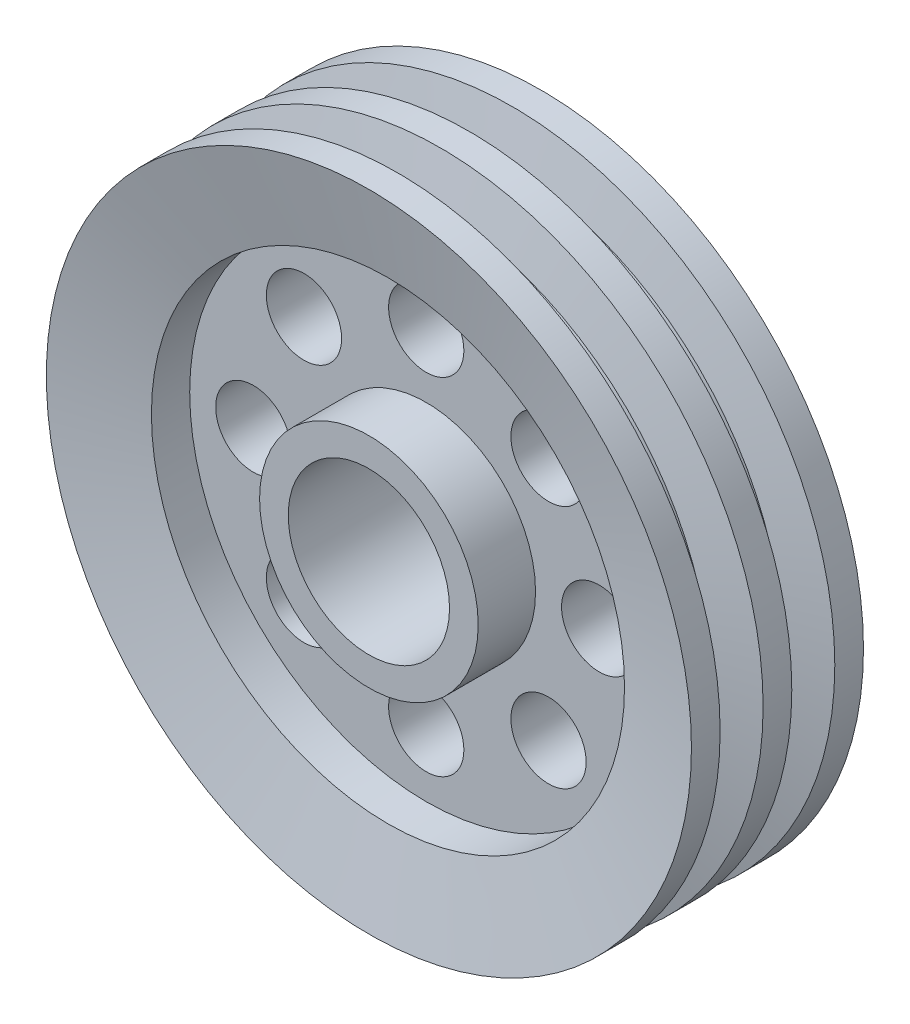
ISO-10303-21;
HEADER;
FILE_DESCRIPTION(('STEP AP214'),'2;1');
FILE_NAME('part.step','',(''),(''),'','','');
FILE_SCHEMA(('AUTOMOTIVE_DESIGN { 1 0 10303 214 1 1 1 1 }'));
ENDSEC;
DATA;
#1=APPLICATION_CONTEXT('core data for automotive mechanical design processes');
#2=APPLICATION_PROTOCOL_DEFINITION('international standard','automotive_design',2000,#1);
#3=PRODUCT_CONTEXT('',#1,'mechanical');
#4=PRODUCT('Part','Part','',(#3));
#5=PRODUCT_RELATED_PRODUCT_CATEGORY('part','',(#4));
#6=PRODUCT_DEFINITION_FORMATION('','',#4);
#7=PRODUCT_DEFINITION_CONTEXT('part definition',#1,'design');
#8=PRODUCT_DEFINITION('design','',#6,#7);
#9=PRODUCT_DEFINITION_SHAPE('','',#8);
#10=(LENGTH_UNIT() NAMED_UNIT(*) SI_UNIT(.MILLI.,.METRE.));
#11=(NAMED_UNIT(*) PLANE_ANGLE_UNIT() SI_UNIT($,.RADIAN.));
#12=(NAMED_UNIT(*) SI_UNIT($,.STERADIAN.) SOLID_ANGLE_UNIT());
#13=UNCERTAINTY_MEASURE_WITH_UNIT(LENGTH_MEASURE(1.E-05),#10,'distance_accuracy_value','');
#14=(GEOMETRIC_REPRESENTATION_CONTEXT(3) GLOBAL_UNCERTAINTY_ASSIGNED_CONTEXT((#13)) GLOBAL_UNIT_ASSIGNED_CONTEXT((#10,
#11,#12)) REPRESENTATION_CONTEXT('',''));
#15=CARTESIAN_POINT('',(0.,0.,0.));
#16=DIRECTION('',(0.,0.,1.));
#17=DIRECTION('',(1.,0.,0.));
#18=AXIS2_PLACEMENT_3D('',#15,#16,#17);
#19=CARTESIAN_POINT('',(0.,0.,40.));
#20=DIRECTION('',(0.,0.,-1.));
#21=DIRECTION('',(-1.,0.,0.));
#22=AXIS2_PLACEMENT_3D('',#19,#20,#21);
#23=CYLINDRICAL_SURFACE('',#22,150.);
#24=CARTESIAN_POINT('',(0.,0.,-40.));
#25=DIRECTION('',(0.,0.,1.));
#26=DIRECTION('',(1.,0.,0.));
#27=AXIS2_PLACEMENT_3D('',#24,#25,#26);
#28=CIRCLE('',#27,150.);
#29=CARTESIAN_POINT('',(150.,0.,-40.));
#30=VERTEX_POINT('',#29);
#31=EDGE_CURVE('E171',#30,#30,#28,.T.);
#32=ORIENTED_EDGE('',*,*,#31,.T.);
#33=EDGE_LOOP('',(#32));
#34=FACE_BOUND('',#33,.T.);
#35=CARTESIAN_POINT('',(0.,0.,-26.6666666666667));
#36=DIRECTION('',(0.,0.,1.));
#37=DIRECTION('',(1.,0.,0.));
#38=AXIS2_PLACEMENT_3D('',#35,#36,#37);
#39=CIRCLE('',#38,150.);
#40=CARTESIAN_POINT('',(150.,0.,-26.6666666666667));
#41=VERTEX_POINT('',#40);
#42=EDGE_CURVE('E404',#41,#41,#39,.T.);
#43=ORIENTED_EDGE('',*,*,#42,.F.);
#44=EDGE_LOOP('',(#43));
#45=FACE_BOUND('',#44,.T.);
#46=ADVANCED_FACE('F50',(#34,#45),#23,.T.);
#47=CARTESIAN_POINT('',(0.,0.,6.66666666666667));
#48=DIRECTION('',(0.,0.,1.));
#49=DIRECTION('',(1.,0.,0.));
#50=AXIS2_PLACEMENT_3D('',#47,#48,#49);
#51=CIRCLE('',#50,150.);
#52=CARTESIAN_POINT('',(150.,0.,6.66666666666667));
#53=VERTEX_POINT('',#52);
#54=EDGE_CURVE('E407',#53,#53,#51,.T.);
#55=ORIENTED_EDGE('',*,*,#54,.F.);
#56=EDGE_LOOP('',(#55));
#57=FACE_BOUND('',#56,.T.);
#58=CARTESIAN_POINT('',(0.,0.,-6.66666666666667));
#59=DIRECTION('',(0.,0.,1.));
#60=DIRECTION('',(1.,0.,0.));
#61=AXIS2_PLACEMENT_3D('',#58,#59,#60);
#62=CIRCLE('',#61,150.);
#63=CARTESIAN_POINT('',(150.,0.,-6.66666666666667));
#64=VERTEX_POINT('',#63);
#65=EDGE_CURVE('E400',#64,#64,#62,.T.);
#66=ORIENTED_EDGE('',*,*,#65,.T.);
#67=EDGE_LOOP('',(#66));
#68=FACE_BOUND('',#67,.T.);
#69=ADVANCED_FACE('F148',(#57,#68),#23,.T.);
#70=CARTESIAN_POINT('',(0.,0.,40.));
#71=DIRECTION('',(0.,0.,1.));
#72=DIRECTION('',(1.,0.,0.));
#73=AXIS2_PLACEMENT_3D('',#70,#71,#72);
#74=CIRCLE('',#73,150.);
#75=CARTESIAN_POINT('',(150.,0.,40.));
#76=VERTEX_POINT('',#75);
#77=EDGE_CURVE('E169',#76,#76,#74,.T.);
#78=ORIENTED_EDGE('',*,*,#77,.F.);
#79=EDGE_LOOP('',(#78));
#80=FACE_BOUND('',#79,.T.);
#81=CARTESIAN_POINT('',(0.,0.,26.6666666666667));
#82=DIRECTION('',(0.,0.,1.));
#83=DIRECTION('',(1.,0.,0.));
#84=AXIS2_PLACEMENT_3D('',#81,#82,#83);
#85=CIRCLE('',#84,150.);
#86=CARTESIAN_POINT('',(150.,0.,26.6666666666667));
#87=VERTEX_POINT('',#86);
#88=EDGE_CURVE('E173',#87,#87,#85,.T.);
#89=ORIENTED_EDGE('',*,*,#88,.T.);
#90=EDGE_LOOP('',(#89));
#91=FACE_BOUND('',#90,.T.);
#92=ADVANCED_FACE('F146',(#80,#91),#23,.T.);
#93=CARTESIAN_POINT('',(0.,0.,40.));
#94=DIRECTION('',(0.,0.,-1.));
#95=DIRECTION('',(-1.,0.,0.));
#96=AXIS2_PLACEMENT_3D('',#93,#94,#95);
#97=CYLINDRICAL_SURFACE('',#96,110.);
#98=CARTESIAN_POINT('',(0.,0.,-13.3333333333333));
#99=DIRECTION('',(0.,0.,1.));
#100=DIRECTION('',(1.,0.,0.));
#101=AXIS2_PLACEMENT_3D('',#98,#99,#100);
#102=CIRCLE('',#101,110.);
#103=CARTESIAN_POINT('',(110.,0.,-13.3333333333333));
#104=VERTEX_POINT('',#103);
#105=EDGE_CURVE('E70',#104,#104,#102,.T.);
#106=ORIENTED_EDGE('',*,*,#105,.T.);
#107=EDGE_LOOP('',(#106));
#108=FACE_BOUND('',#107,.T.);
#109=CARTESIAN_POINT('',(0.,0.,-31.1322134942825));
#110=DIRECTION('',(0.,0.,1.));
#111=DIRECTION('',(1.,0.,0.));
#112=AXIS2_PLACEMENT_3D('',#109,#110,#111);
#113=CIRCLE('',#112,110.);
#114=CARTESIAN_POINT('',(110.,0.,-31.1322134942825));
#115=VERTEX_POINT('',#114);
#116=EDGE_CURVE('E178',#115,#115,#113,.T.);
#117=ORIENTED_EDGE('',*,*,#116,.F.);
#118=EDGE_LOOP('',(#117));
#119=FACE_BOUND('',#118,.T.);
#120=ADVANCED_FACE('F142',(#108,#119),#97,.F.);
#121=CARTESIAN_POINT('',(0.,0.,31.1322134942825));
#122=DIRECTION('',(0.,0.,1.));
#123=DIRECTION('',(1.,0.,0.));
#124=AXIS2_PLACEMENT_3D('',#121,#122,#123);
#125=CIRCLE('',#124,110.);
#126=CARTESIAN_POINT('',(110.,0.,31.1322134942825));
#127=VERTEX_POINT('',#126);
#128=EDGE_CURVE('E188',#127,#127,#125,.T.);
#129=ORIENTED_EDGE('',*,*,#128,.T.);
#130=EDGE_LOOP('',(#129));
#131=FACE_BOUND('',#130,.T.);
#132=CARTESIAN_POINT('',(0.,0.,13.3333333333333));
#133=DIRECTION('',(0.,0.,1.));
#134=DIRECTION('',(1.,0.,0.));
#135=AXIS2_PLACEMENT_3D('',#132,#133,#134);
#136=CIRCLE('',#135,110.);
#137=CARTESIAN_POINT('',(110.,0.,13.3333333333333));
#138=VERTEX_POINT('',#137);
#139=EDGE_CURVE('E11',#138,#138,#136,.T.);
#140=ORIENTED_EDGE('',*,*,#139,.F.);
#141=EDGE_LOOP('',(#140));
#142=FACE_BOUND('',#141,.T.);
#143=ADVANCED_FACE('F47',(#131,#142),#97,.F.);
#144=CARTESIAN_POINT('',(56.8631703204182,56.8631703204182,13.3333333333333));
#145=DIRECTION('',(0.,0.,-1.));
#146=DIRECTION('',(-1.,0.,0.));
#147=AXIS2_PLACEMENT_3D('',#144,#145,#146);
#148=CYLINDRICAL_SURFACE('',#147,17.5);
#149=CARTESIAN_POINT('',(56.8631703204182,56.8631703204182,13.3333333333333));
#150=DIRECTION('',(0.,0.,1.));
#151=DIRECTION('',(1.,0.,0.));
#152=AXIS2_PLACEMENT_3D('',#149,#150,#151);
#153=CIRCLE('',#152,17.5);
#154=CARTESIAN_POINT('',(74.3631703204182,56.8631703204182,13.3333333333333));
#155=VERTEX_POINT('',#154);
#156=EDGE_CURVE('E59',#155,#155,#153,.T.);
#157=ORIENTED_EDGE('',*,*,#156,.T.);
#158=EDGE_LOOP('',(#157));
#159=FACE_BOUND('',#158,.T.);
#160=CARTESIAN_POINT('',(56.8631703204182,56.8631703204182,-13.3333333333333));
#161=DIRECTION('',(0.,0.,1.));
#162=DIRECTION('',(1.,0.,0.));
#163=AXIS2_PLACEMENT_3D('',#160,#161,#162);
#164=CIRCLE('',#163,17.5);
#165=CARTESIAN_POINT('',(74.3631703204182,56.8631703204182,-13.3333333333333));
#166=VERTEX_POINT('',#165);
#167=EDGE_CURVE('E93',#166,#166,#164,.T.);
#168=ORIENTED_EDGE('',*,*,#167,.F.);
#169=EDGE_LOOP('',(#168));
#170=FACE_BOUND('',#169,.T.);
#171=ADVANCED_FACE('F135',(#159,#170),#148,.F.);
#172=CARTESIAN_POINT('',(80.4166666666667,0.,13.3333333333333));
#173=DIRECTION('',(0.,0.,-1.));
#174=DIRECTION('',(-1.,0.,0.));
#175=AXIS2_PLACEMENT_3D('',#172,#173,#174);
#176=CYLINDRICAL_SURFACE('',#175,17.5);
#177=CARTESIAN_POINT('',(80.4166666666667,0.,13.3333333333333));
#178=DIRECTION('',(0.,0.,1.));
#179=DIRECTION('',(1.,0.,0.));
#180=AXIS2_PLACEMENT_3D('',#177,#178,#179);
#181=CIRCLE('',#180,17.5);
#182=CARTESIAN_POINT('',(97.9166666666667,0.,13.3333333333333));
#183=VERTEX_POINT('',#182);
#184=EDGE_CURVE('E61',#183,#183,#181,.T.);
#185=ORIENTED_EDGE('',*,*,#184,.T.);
#186=EDGE_LOOP('',(#185));
#187=FACE_BOUND('',#186,.T.);
#188=CARTESIAN_POINT('',(80.4166666666667,0.,-13.3333333333333));
#189=DIRECTION('',(0.,0.,1.));
#190=DIRECTION('',(1.,0.,0.));
#191=AXIS2_PLACEMENT_3D('',#188,#189,#190);
#192=CIRCLE('',#191,17.5);
#193=CARTESIAN_POINT('',(97.9166666666667,0.,-13.3333333333333));
#194=VERTEX_POINT('',#193);
#195=EDGE_CURVE('E90',#194,#194,#192,.T.);
#196=ORIENTED_EDGE('',*,*,#195,.F.);
#197=EDGE_LOOP('',(#196));
#198=FACE_BOUND('',#197,.T.);
#199=ADVANCED_FACE('F117',(#187,#198),#176,.F.);
#200=CARTESIAN_POINT('',(56.8631703204182,-56.8631703204182,13.3333333333333));
#201=DIRECTION('',(0.,0.,-1.));
#202=DIRECTION('',(-1.,0.,0.));
#203=AXIS2_PLACEMENT_3D('',#200,#201,#202);
#204=CYLINDRICAL_SURFACE('',#203,17.5);
#205=CARTESIAN_POINT('',(56.8631703204182,-56.8631703204182,13.3333333333333));
#206=DIRECTION('',(0.,0.,1.));
#207=DIRECTION('',(1.,0.,0.));
#208=AXIS2_PLACEMENT_3D('',#205,#206,#207);
#209=CIRCLE('',#208,17.5);
#210=CARTESIAN_POINT('',(74.3631703204182,-56.8631703204182,13.3333333333333));
#211=VERTEX_POINT('',#210);
#212=EDGE_CURVE('E113',#211,#211,#209,.T.);
#213=ORIENTED_EDGE('',*,*,#212,.T.);
#214=EDGE_LOOP('',(#213));
#215=FACE_BOUND('',#214,.T.);
#216=CARTESIAN_POINT('',(56.8631703204182,-56.8631703204182,-13.3333333333333));
#217=DIRECTION('',(0.,0.,1.));
#218=DIRECTION('',(1.,0.,0.));
#219=AXIS2_PLACEMENT_3D('',#216,#217,#218);
#220=CIRCLE('',#219,17.5);
#221=CARTESIAN_POINT('',(74.3631703204182,-56.8631703204182,-13.3333333333333));
#222=VERTEX_POINT('',#221);
#223=EDGE_CURVE('E88',#222,#222,#220,.T.);
#224=ORIENTED_EDGE('',*,*,#223,.F.);
#225=EDGE_LOOP('',(#224));
#226=FACE_BOUND('',#225,.T.);
#227=ADVANCED_FACE('F137',(#215,#226),#204,.F.);
#228=CARTESIAN_POINT('',(0.,-80.4166666666667,13.3333333333333));
#229=DIRECTION('',(0.,0.,-1.));
#230=DIRECTION('',(-1.,0.,0.));
#231=AXIS2_PLACEMENT_3D('',#228,#229,#230);
#232=CYLINDRICAL_SURFACE('',#231,17.5);
#233=CARTESIAN_POINT('',(0.,-80.4166666666667,13.3333333333333));
#234=DIRECTION('',(0.,0.,1.));
#235=DIRECTION('',(1.,0.,0.));
#236=AXIS2_PLACEMENT_3D('',#233,#234,#235);
#237=CIRCLE('',#236,17.5);
#238=CARTESIAN_POINT('',(17.5,-80.4166666666667,13.3333333333333));
#239=VERTEX_POINT('',#238);
#240=EDGE_CURVE('E115',#239,#239,#237,.T.);
#241=ORIENTED_EDGE('',*,*,#240,.T.);
#242=EDGE_LOOP('',(#241));
#243=FACE_BOUND('',#242,.T.);
#244=CARTESIAN_POINT('',(0.,-80.4166666666667,-13.3333333333333));
#245=DIRECTION('',(0.,0.,1.));
#246=DIRECTION('',(1.,0.,0.));
#247=AXIS2_PLACEMENT_3D('',#244,#245,#246);
#248=CIRCLE('',#247,17.5);
#249=CARTESIAN_POINT('',(17.5,-80.4166666666667,-13.3333333333333));
#250=VERTEX_POINT('',#249);
#251=EDGE_CURVE('E81',#250,#250,#248,.T.);
#252=ORIENTED_EDGE('',*,*,#251,.F.);
#253=EDGE_LOOP('',(#252));
#254=FACE_BOUND('',#253,.T.);
#255=ADVANCED_FACE('F253',(#243,#254),#232,.F.);
#256=CARTESIAN_POINT('',(-56.8631703204182,-56.8631703204182,13.3333333333333));
#257=DIRECTION('',(0.,0.,-1.));
#258=DIRECTION('',(-1.,0.,0.));
#259=AXIS2_PLACEMENT_3D('',#256,#257,#258);
#260=CYLINDRICAL_SURFACE('',#259,17.5);
#261=CARTESIAN_POINT('',(-56.8631703204182,-56.8631703204182,13.3333333333333));
#262=DIRECTION('',(0.,0.,1.));
#263=DIRECTION('',(1.,0.,0.));
#264=AXIS2_PLACEMENT_3D('',#261,#262,#263);
#265=CIRCLE('',#264,17.5);
#266=CARTESIAN_POINT('',(-39.3631703204182,-56.8631703204182,13.3333333333333));
#267=VERTEX_POINT('',#266);
#268=EDGE_CURVE('E108',#267,#267,#265,.T.);
#269=ORIENTED_EDGE('',*,*,#268,.T.);
#270=EDGE_LOOP('',(#269));
#271=FACE_BOUND('',#270,.T.);
#272=CARTESIAN_POINT('',(-56.8631703204182,-56.8631703204182,-13.3333333333333));
#273=DIRECTION('',(0.,0.,1.));
#274=DIRECTION('',(1.,0.,0.));
#275=AXIS2_PLACEMENT_3D('',#272,#273,#274);
#276=CIRCLE('',#275,17.5);
#277=CARTESIAN_POINT('',(-39.3631703204182,-56.8631703204182,-13.3333333333333));
#278=VERTEX_POINT('',#277);
#279=EDGE_CURVE('E77',#278,#278,#276,.T.);
#280=ORIENTED_EDGE('',*,*,#279,.F.);
#281=EDGE_LOOP('',(#280));
#282=FACE_BOUND('',#281,.T.);
#283=ADVANCED_FACE('F260',(#271,#282),#260,.F.);
#284=CARTESIAN_POINT('',(-80.4166666666667,0.,13.3333333333333));
#285=DIRECTION('',(0.,0.,-1.));
#286=DIRECTION('',(-1.,0.,0.));
#287=AXIS2_PLACEMENT_3D('',#284,#285,#286);
#288=CYLINDRICAL_SURFACE('',#287,17.5);
#289=CARTESIAN_POINT('',(-80.4166666666667,0.,13.3333333333333));
#290=DIRECTION('',(0.,0.,1.));
#291=DIRECTION('',(1.,0.,0.));
#292=AXIS2_PLACEMENT_3D('',#289,#290,#291);
#293=CIRCLE('',#292,17.5);
#294=CARTESIAN_POINT('',(-62.9166666666667,0.,13.3333333333333));
#295=VERTEX_POINT('',#294);
#296=EDGE_CURVE('E105',#295,#295,#293,.T.);
#297=ORIENTED_EDGE('',*,*,#296,.T.);
#298=EDGE_LOOP('',(#297));
#299=FACE_BOUND('',#298,.T.);
#300=CARTESIAN_POINT('',(-80.4166666666667,0.,-13.3333333333333));
#301=DIRECTION('',(0.,0.,1.));
#302=DIRECTION('',(1.,0.,0.));
#303=AXIS2_PLACEMENT_3D('',#300,#301,#302);
#304=CIRCLE('',#303,17.5);
#305=CARTESIAN_POINT('',(-62.9166666666667,0.,-13.3333333333333));
#306=VERTEX_POINT('',#305);
#307=EDGE_CURVE('E80',#306,#306,#304,.T.);
#308=ORIENTED_EDGE('',*,*,#307,.F.);
#309=EDGE_LOOP('',(#308));
#310=FACE_BOUND('',#309,.T.);
#311=ADVANCED_FACE('F263',(#299,#310),#288,.F.);
#312=CARTESIAN_POINT('',(-56.8631703204182,56.8631703204182,13.3333333333333));
#313=DIRECTION('',(0.,0.,-1.));
#314=DIRECTION('',(-1.,0.,0.));
#315=AXIS2_PLACEMENT_3D('',#312,#313,#314);
#316=CYLINDRICAL_SURFACE('',#315,17.5);
#317=CARTESIAN_POINT('',(-56.8631703204182,56.8631703204182,13.3333333333333));
#318=DIRECTION('',(0.,0.,1.));
#319=DIRECTION('',(1.,0.,0.));
#320=AXIS2_PLACEMENT_3D('',#317,#318,#319);
#321=CIRCLE('',#320,17.5);
#322=CARTESIAN_POINT('',(-39.3631703204182,56.8631703204182,13.3333333333333));
#323=VERTEX_POINT('',#322);
#324=EDGE_CURVE('E100',#323,#323,#321,.T.);
#325=ORIENTED_EDGE('',*,*,#324,.T.);
#326=EDGE_LOOP('',(#325));
#327=FACE_BOUND('',#326,.T.);
#328=CARTESIAN_POINT('',(-56.8631703204182,56.8631703204182,-13.3333333333333));
#329=DIRECTION('',(0.,0.,1.));
#330=DIRECTION('',(1.,0.,0.));
#331=AXIS2_PLACEMENT_3D('',#328,#329,#330);
#332=CIRCLE('',#331,17.5);
#333=CARTESIAN_POINT('',(-39.3631703204182,56.8631703204182,-13.3333333333333));
#334=VERTEX_POINT('',#333);
#335=EDGE_CURVE('E74',#334,#334,#332,.T.);
#336=ORIENTED_EDGE('',*,*,#335,.F.);
#337=EDGE_LOOP('',(#336));
#338=FACE_BOUND('',#337,.T.);
#339=ADVANCED_FACE('F270',(#327,#338),#316,.F.);
#340=CARTESIAN_POINT('',(0.,80.4166666666667,13.3333333333333));
#341=DIRECTION('',(0.,0.,-1.));
#342=DIRECTION('',(-1.,0.,0.));
#343=AXIS2_PLACEMENT_3D('',#340,#341,#342);
#344=CYLINDRICAL_SURFACE('',#343,17.5);
#345=CARTESIAN_POINT('',(0.,80.4166666666667,13.3333333333333));
#346=DIRECTION('',(0.,0.,1.));
#347=DIRECTION('',(1.,0.,0.));
#348=AXIS2_PLACEMENT_3D('',#345,#346,#347);
#349=CIRCLE('',#348,17.5);
#350=CARTESIAN_POINT('',(17.5,80.4166666666667,13.3333333333333));
#351=VERTEX_POINT('',#350);
#352=EDGE_CURVE('E91',#351,#351,#349,.T.);
#353=ORIENTED_EDGE('',*,*,#352,.T.);
#354=EDGE_LOOP('',(#353));
#355=FACE_BOUND('',#354,.T.);
#356=CARTESIAN_POINT('',(0.,80.4166666666667,-13.3333333333333));
#357=DIRECTION('',(0.,0.,1.));
#358=DIRECTION('',(1.,0.,0.));
#359=AXIS2_PLACEMENT_3D('',#356,#357,#358);
#360=CIRCLE('',#359,17.5);
#361=CARTESIAN_POINT('',(17.5,80.4166666666667,-13.3333333333333));
#362=VERTEX_POINT('',#361);
#363=EDGE_CURVE('E69',#362,#362,#360,.T.);
#364=ORIENTED_EDGE('',*,*,#363,.F.);
#365=EDGE_LOOP('',(#364));
#366=FACE_BOUND('',#365,.T.);
#367=ADVANCED_FACE('F130',(#355,#366),#344,.F.);
#368=CARTESIAN_POINT('',(0.,0.,13.3333333333333));
#369=DIRECTION('',(0.,0.,1.));
#370=DIRECTION('',(1.,0.,0.));
#371=AXIS2_PLACEMENT_3D('',#368,#369,#370);
#372=PLANE('',#371);
#373=ORIENTED_EDGE('',*,*,#139,.T.);
#374=EDGE_LOOP('',(#373));
#375=FACE_BOUND('',#374,.T.);
#376=ORIENTED_EDGE('',*,*,#352,.F.);
#377=EDGE_LOOP('',(#376));
#378=FACE_BOUND('',#377,.T.);
#379=ORIENTED_EDGE('',*,*,#324,.F.);
#380=EDGE_LOOP('',(#379));
#381=FACE_BOUND('',#380,.T.);
#382=ORIENTED_EDGE('',*,*,#296,.F.);
#383=EDGE_LOOP('',(#382));
#384=FACE_BOUND('',#383,.T.);
#385=ORIENTED_EDGE('',*,*,#268,.F.);
#386=EDGE_LOOP('',(#385));
#387=FACE_BOUND('',#386,.T.);
#388=ORIENTED_EDGE('',*,*,#240,.F.);
#389=EDGE_LOOP('',(#388));
#390=FACE_BOUND('',#389,.T.);
#391=ORIENTED_EDGE('',*,*,#212,.F.);
#392=EDGE_LOOP('',(#391));
#393=FACE_BOUND('',#392,.T.);
#394=ORIENTED_EDGE('',*,*,#184,.F.);
#395=EDGE_LOOP('',(#394));
#396=FACE_BOUND('',#395,.T.);
#397=ORIENTED_EDGE('',*,*,#156,.F.);
#398=EDGE_LOOP('',(#397));
#399=FACE_BOUND('',#398,.T.);
#400=CARTESIAN_POINT('',(0.,0.,13.3333333333333));
#401=DIRECTION('',(0.,0.,1.));
#402=DIRECTION('',(1.,0.,0.));
#403=AXIS2_PLACEMENT_3D('',#400,#401,#402);
#404=CIRCLE('',#403,50.8333333333333);
#405=CARTESIAN_POINT('',(50.8333333333333,0.,13.3333333333333));
#406=VERTEX_POINT('',#405);
#407=EDGE_CURVE('E53',#406,#406,#404,.T.);
#408=ORIENTED_EDGE('',*,*,#407,.F.);
#409=EDGE_LOOP('',(#408));
#410=FACE_BOUND('',#409,.T.);
#411=ADVANCED_FACE('F121',(#375,#378,#381,#384,#387,#390,#393,#396,#399,#410),#372,.T.);
#412=CARTESIAN_POINT('',(0.,0.,-13.3333333333333));
#413=DIRECTION('',(0.,0.,1.));
#414=DIRECTION('',(1.,0.,0.));
#415=AXIS2_PLACEMENT_3D('',#412,#413,#414);
#416=PLANE('',#415);
#417=ORIENTED_EDGE('',*,*,#105,.F.);
#418=EDGE_LOOP('',(#417));
#419=FACE_BOUND('',#418,.T.);
#420=ORIENTED_EDGE('',*,*,#363,.T.);
#421=EDGE_LOOP('',(#420));
#422=FACE_BOUND('',#421,.T.);
#423=ORIENTED_EDGE('',*,*,#335,.T.);
#424=EDGE_LOOP('',(#423));
#425=FACE_BOUND('',#424,.T.);
#426=ORIENTED_EDGE('',*,*,#307,.T.);
#427=EDGE_LOOP('',(#426));
#428=FACE_BOUND('',#427,.T.);
#429=ORIENTED_EDGE('',*,*,#279,.T.);
#430=EDGE_LOOP('',(#429));
#431=FACE_BOUND('',#430,.T.);
#432=ORIENTED_EDGE('',*,*,#251,.T.);
#433=EDGE_LOOP('',(#432));
#434=FACE_BOUND('',#433,.T.);
#435=ORIENTED_EDGE('',*,*,#223,.T.);
#436=EDGE_LOOP('',(#435));
#437=FACE_BOUND('',#436,.T.);
#438=ORIENTED_EDGE('',*,*,#195,.T.);
#439=EDGE_LOOP('',(#438));
#440=FACE_BOUND('',#439,.T.);
#441=ORIENTED_EDGE('',*,*,#167,.T.);
#442=EDGE_LOOP('',(#441));
#443=FACE_BOUND('',#442,.T.);
#444=CARTESIAN_POINT('',(0.,0.,-13.3333333333333));
#445=DIRECTION('',(0.,0.,1.));
#446=DIRECTION('',(1.,0.,0.));
#447=AXIS2_PLACEMENT_3D('',#444,#445,#446);
#448=CIRCLE('',#447,50.8333333333333);
#449=CARTESIAN_POINT('',(50.8333333333333,0.,-13.3333333333333));
#450=VERTEX_POINT('',#449);
#451=EDGE_CURVE('E72',#450,#450,#448,.F.);
#452=ORIENTED_EDGE('',*,*,#451,.F.);
#453=EDGE_LOOP('',(#452));
#454=FACE_BOUND('',#453,.T.);
#455=ADVANCED_FACE('F127',(#419,#422,#425,#428,#431,#434,#437,#440,#443,#454),#416,.F.);
#456=CARTESIAN_POINT('',(0.,0.,40.));
#457=DIRECTION('',(0.,0.,-1.));
#458=DIRECTION('',(-1.,0.,0.));
#459=AXIS2_PLACEMENT_3D('',#456,#457,#458);
#460=CYLINDRICAL_SURFACE('',#459,50.8333333333333);
#461=CARTESIAN_POINT('',(0.,0.,-40.));
#462=DIRECTION('',(0.,0.,1.));
#463=DIRECTION('',(1.,0.,0.));
#464=AXIS2_PLACEMENT_3D('',#461,#462,#463);
#465=CIRCLE('',#464,50.8333333333333);
#466=CARTESIAN_POINT('',(50.8333333333333,0.,-40.));
#467=VERTEX_POINT('',#466);
#468=EDGE_CURVE('E192',#467,#467,#465,.T.);
#469=ORIENTED_EDGE('',*,*,#468,.T.);
#470=EDGE_LOOP('',(#469));
#471=FACE_BOUND('',#470,.T.);
#472=ORIENTED_EDGE('',*,*,#451,.T.);
#473=EDGE_LOOP('',(#472));
#474=FACE_BOUND('',#473,.T.);
#475=ADVANCED_FACE('F203',(#471,#474),#460,.T.);
#476=CARTESIAN_POINT('',(0.,0.,40.));
#477=DIRECTION('',(0.,0.,-1.));
#478=DIRECTION('',(-1.,0.,0.));
#479=AXIS2_PLACEMENT_3D('',#476,#477,#478);
#480=CYLINDRICAL_SURFACE('',#479,37.5);
#481=CARTESIAN_POINT('',(0.,0.,40.));
#482=DIRECTION('',(0.,0.,1.));
#483=DIRECTION('',(1.,0.,0.));
#484=AXIS2_PLACEMENT_3D('',#481,#482,#483);
#485=CIRCLE('',#484,37.5);
#486=CARTESIAN_POINT('',(37.5,0.,40.));
#487=VERTEX_POINT('',#486);
#488=EDGE_CURVE('E187',#487,#487,#485,.T.);
#489=ORIENTED_EDGE('',*,*,#488,.T.);
#490=EDGE_LOOP('',(#489));
#491=FACE_BOUND('',#490,.T.);
#492=CARTESIAN_POINT('',(0.,0.,-40.));
#493=DIRECTION('',(0.,0.,1.));
#494=DIRECTION('',(1.,0.,0.));
#495=AXIS2_PLACEMENT_3D('',#492,#493,#494);
#496=CIRCLE('',#495,37.5);
#497=CARTESIAN_POINT('',(37.5,0.,-40.));
#498=VERTEX_POINT('',#497);
#499=EDGE_CURVE('E189',#498,#498,#496,.T.);
#500=ORIENTED_EDGE('',*,*,#499,.F.);
#501=EDGE_LOOP('',(#500));
#502=FACE_BOUND('',#501,.T.);
#503=ADVANCED_FACE('F224',(#491,#502),#480,.F.);
#504=ORIENTED_EDGE('',*,*,#407,.T.);
#505=EDGE_LOOP('',(#504));
#506=FACE_BOUND('',#505,.T.);
#507=CARTESIAN_POINT('',(0.,0.,40.));
#508=DIRECTION('',(0.,0.,1.));
#509=DIRECTION('',(1.,0.,0.));
#510=AXIS2_PLACEMENT_3D('',#507,#508,#509);
#511=CIRCLE('',#510,50.8333333333333);
#512=CARTESIAN_POINT('',(50.8333333333333,0.,40.));
#513=VERTEX_POINT('',#512);
#514=EDGE_CURVE('E191',#513,#513,#511,.T.);
#515=ORIENTED_EDGE('',*,*,#514,.F.);
#516=EDGE_LOOP('',(#515));
#517=FACE_BOUND('',#516,.T.);
#518=ADVANCED_FACE('F220',(#506,#517),#460,.T.);
#519=CARTESIAN_POINT('',(0.,0.,40.));
#520=DIRECTION('',(0.,0.,1.));
#521=DIRECTION('',(1.,0.,0.));
#522=AXIS2_PLACEMENT_3D('',#519,#520,#521);
#523=PLANE('',#522);
#524=ORIENTED_EDGE('',*,*,#488,.F.);
#525=EDGE_LOOP('',(#524));
#526=FACE_BOUND('',#525,.T.);
#527=ORIENTED_EDGE('',*,*,#514,.T.);
#528=EDGE_LOOP('',(#527));
#529=FACE_BOUND('',#528,.T.);
#530=ADVANCED_FACE('F210',(#526,#529),#523,.T.);
#531=CARTESIAN_POINT('',(0.,0.,-40.));
#532=DIRECTION('',(0.,0.,1.));
#533=DIRECTION('',(1.,0.,0.));
#534=AXIS2_PLACEMENT_3D('',#531,#532,#533);
#535=PLANE('',#534);
#536=ORIENTED_EDGE('',*,*,#499,.T.);
#537=EDGE_LOOP('',(#536));
#538=FACE_BOUND('',#537,.T.);
#539=ORIENTED_EDGE('',*,*,#468,.F.);
#540=EDGE_LOOP('',(#539));
#541=FACE_BOUND('',#540,.T.);
#542=ADVANCED_FACE('F204',(#538,#541),#535,.F.);
#543=CARTESIAN_POINT('',(0.,0.,40.));
#544=DIRECTION('',(0.,0.,1.));
#545=DIRECTION('',(1.,0.,0.));
#546=AXIS2_PLACEMENT_3D('',#543,#544,#545);
#547=CONICAL_SURFACE('',#546,150.,1.35263017029561);
#548=ORIENTED_EDGE('',*,*,#128,.F.);
#549=EDGE_LOOP('',(#548));
#550=FACE_BOUND('',#549,.T.);
#551=ORIENTED_EDGE('',*,*,#77,.T.);
#552=EDGE_LOOP('',(#551));
#553=FACE_BOUND('',#552,.T.);
#554=ADVANCED_FACE('F206',(#550,#553),#547,.F.);
#555=CARTESIAN_POINT('',(0.,0.,-40.));
#556=DIRECTION('',(0.,0.,-1.));
#557=DIRECTION('',(-1.,0.,0.));
#558=AXIS2_PLACEMENT_3D('',#555,#556,#557);
#559=CONICAL_SURFACE('',#558,150.,1.35263017029561);
#560=ORIENTED_EDGE('',*,*,#116,.T.);
#561=EDGE_LOOP('',(#560));
#562=FACE_BOUND('',#561,.T.);
#563=ORIENTED_EDGE('',*,*,#31,.F.);
#564=EDGE_LOOP('',(#563));
#565=FACE_BOUND('',#564,.T.);
#566=ADVANCED_FACE('F212',(#562,#565),#559,.F.);
#567=CARTESIAN_POINT('',(0.,0.,26.6666666666667));
#568=DIRECTION('',(0.,0.,1.));
#569=DIRECTION('',(1.,0.,0.));
#570=AXIS2_PLACEMENT_3D('',#567,#568,#569);
#571=CONICAL_SURFACE('',#570,150.,1.35263017029561);
#572=CARTESIAN_POINT('',(0.,0.,22.2327734138079));
#573=DIRECTION('',(0.,0.,1.));
#574=DIRECTION('',(1.,0.,0.));
#575=AXIS2_PLACEMENT_3D('',#572,#573,#574);
#576=CIRCLE('',#575,130.);
#577=CARTESIAN_POINT('',(130.,0.,22.2327734138079));
#578=VERTEX_POINT('',#577);
#579=EDGE_CURVE('E174',#578,#578,#576,.T.);
#580=ORIENTED_EDGE('',*,*,#579,.T.);
#581=EDGE_LOOP('',(#580));
#582=FACE_BOUND('',#581,.T.);
#583=ORIENTED_EDGE('',*,*,#88,.F.);
#584=EDGE_LOOP('',(#583));
#585=FACE_BOUND('',#584,.T.);
#586=ADVANCED_FACE('F307',(#582,#585),#571,.T.);
#587=CARTESIAN_POINT('',(0.,0.,46.0273802266001));
#588=DIRECTION('',(0.,0.,1.));
#589=DIRECTION('',(1.,0.,0.));
#590=AXIS2_PLACEMENT_3D('',#587,#588,#589);
#591=CYLINDRICAL_SURFACE('',#590,130.);
#592=CARTESIAN_POINT('',(0.,0.,11.1005599195254));
#593=DIRECTION('',(0.,0.,1.));
#594=DIRECTION('',(1.,0.,0.));
#595=AXIS2_PLACEMENT_3D('',#592,#593,#594);
#596=CIRCLE('',#595,130.);
#597=CARTESIAN_POINT('',(130.,0.,11.1005599195254));
#598=VERTEX_POINT('',#597);
#599=EDGE_CURVE('E177',#598,#598,#596,.T.);
#600=ORIENTED_EDGE('',*,*,#599,.T.);
#601=EDGE_LOOP('',(#600));
#602=FACE_BOUND('',#601,.T.);
#603=ORIENTED_EDGE('',*,*,#579,.F.);
#604=EDGE_LOOP('',(#603));
#605=FACE_BOUND('',#604,.T.);
#606=ADVANCED_FACE('F319',(#602,#605),#591,.T.);
#607=CARTESIAN_POINT('',(0.,0.,11.1005599195254));
#608=DIRECTION('',(0.,0.,-1.));
#609=DIRECTION('',(-1.,0.,0.));
#610=AXIS2_PLACEMENT_3D('',#607,#608,#609);
#611=CONICAL_SURFACE('',#610,130.,1.35263017029561);
#612=ORIENTED_EDGE('',*,*,#54,.T.);
#613=EDGE_LOOP('',(#612));
#614=FACE_BOUND('',#613,.T.);
#615=ORIENTED_EDGE('',*,*,#599,.F.);
#616=EDGE_LOOP('',(#615));
#617=FACE_BOUND('',#616,.T.);
#618=ADVANCED_FACE('F334',(#614,#617),#611,.T.);
#619=CARTESIAN_POINT('',(0.,0.,-26.6666666666667));
#620=DIRECTION('',(0.,0.,-1.));
#621=DIRECTION('',(1.,0.,0.));
#622=AXIS2_PLACEMENT_3D('',#619,#620,#621);
#623=CONICAL_SURFACE('',#622,150.,1.35263017029561);
#624=CARTESIAN_POINT('',(0.,0.,-22.2327734138079));
#625=DIRECTION('',(0.,0.,1.));
#626=DIRECTION('',(1.,0.,0.));
#627=AXIS2_PLACEMENT_3D('',#624,#625,#626);
#628=CIRCLE('',#627,130.);
#629=CARTESIAN_POINT('',(130.,0.,-22.2327734138079));
#630=VERTEX_POINT('',#629);
#631=EDGE_CURVE('E402',#630,#630,#628,.T.);
#632=ORIENTED_EDGE('',*,*,#631,.F.);
#633=EDGE_LOOP('',(#632));
#634=FACE_BOUND('',#633,.T.);
#635=ORIENTED_EDGE('',*,*,#42,.T.);
#636=EDGE_LOOP('',(#635));
#637=FACE_BOUND('',#636,.T.);
#638=ADVANCED_FACE('F345',(#634,#637),#623,.T.);
#639=CARTESIAN_POINT('',(0.,0.,-46.0273802266001));
#640=DIRECTION('',(0.,0.,-1.));
#641=DIRECTION('',(1.,0.,0.));
#642=AXIS2_PLACEMENT_3D('',#639,#640,#641);
#643=CYLINDRICAL_SURFACE('',#642,130.);
#644=CARTESIAN_POINT('',(0.,0.,-11.1005599195254));
#645=DIRECTION('',(0.,0.,1.));
#646=DIRECTION('',(1.,0.,0.));
#647=AXIS2_PLACEMENT_3D('',#644,#645,#646);
#648=CIRCLE('',#647,130.);
#649=CARTESIAN_POINT('',(130.,0.,-11.1005599195254));
#650=VERTEX_POINT('',#649);
#651=EDGE_CURVE('E399',#650,#650,#648,.T.);
#652=ORIENTED_EDGE('',*,*,#651,.F.);
#653=EDGE_LOOP('',(#652));
#654=FACE_BOUND('',#653,.T.);
#655=ORIENTED_EDGE('',*,*,#631,.T.);
#656=EDGE_LOOP('',(#655));
#657=FACE_BOUND('',#656,.T.);
#658=ADVANCED_FACE('F364',(#654,#657),#643,.T.);
#659=CARTESIAN_POINT('',(0.,0.,-11.1005599195254));
#660=DIRECTION('',(0.,0.,1.));
#661=DIRECTION('',(-1.,0.,0.));
#662=AXIS2_PLACEMENT_3D('',#659,#660,#661);
#663=CONICAL_SURFACE('',#662,130.,1.35263017029561);
#664=ORIENTED_EDGE('',*,*,#65,.F.);
#665=EDGE_LOOP('',(#664));
#666=FACE_BOUND('',#665,.T.);
#667=ORIENTED_EDGE('',*,*,#651,.T.);
#668=EDGE_LOOP('',(#667));
#669=FACE_BOUND('',#668,.T.);
#670=ADVANCED_FACE('F378',(#666,#669),#663,.T.);
#671=CLOSED_SHELL('',(#46,#69,#92,#120,#143,#171,#199,#227,#255,#283,#311,#339,#367,#411,#455,
#475,#503,#518,#530,#542,#554,#566,#586,#606,#618,#638,#658,#670));
#672=MANIFOLD_SOLID_BREP('B2',#671);
#673=ADVANCED_BREP_SHAPE_REPRESENTATION('',(#18,#672),#14);
#674=SHAPE_DEFINITION_REPRESENTATION(#9,#673);
ENDSEC;
END-ISO-10303-21;
